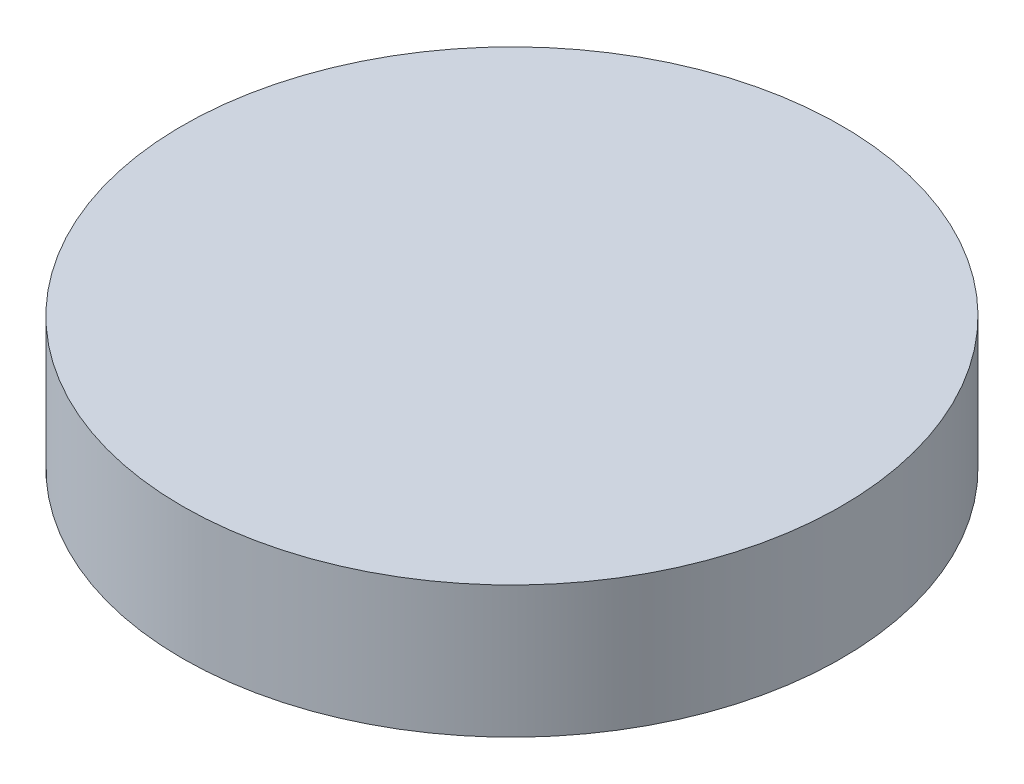
ISO-10303-21;
HEADER;
FILE_DESCRIPTION(('STEP AP214'),'2;1');
FILE_NAME('part.step','',(''),(''),'','','');
FILE_SCHEMA(('AUTOMOTIVE_DESIGN { 1 0 10303 214 1 1 1 1 }'));
ENDSEC;
DATA;
#1=APPLICATION_CONTEXT('core data for automotive mechanical design processes');
#2=APPLICATION_PROTOCOL_DEFINITION('international standard','automotive_design',2000,#1);
#3=PRODUCT_CONTEXT('',#1,'mechanical');
#4=PRODUCT('Part','Part','',(#3));
#5=PRODUCT_RELATED_PRODUCT_CATEGORY('part','',(#4));
#6=PRODUCT_DEFINITION_FORMATION('','',#4);
#7=PRODUCT_DEFINITION_CONTEXT('part definition',#1,'design');
#8=PRODUCT_DEFINITION('design','',#6,#7);
#9=PRODUCT_DEFINITION_SHAPE('','',#8);
#10=(LENGTH_UNIT() NAMED_UNIT(*) SI_UNIT(.MILLI.,.METRE.));
#11=(NAMED_UNIT(*) PLANE_ANGLE_UNIT() SI_UNIT($,.RADIAN.));
#12=(NAMED_UNIT(*) SI_UNIT($,.STERADIAN.) SOLID_ANGLE_UNIT());
#13=UNCERTAINTY_MEASURE_WITH_UNIT(LENGTH_MEASURE(1.E-05),#10,'distance_accuracy_value','');
#14=(GEOMETRIC_REPRESENTATION_CONTEXT(3) GLOBAL_UNCERTAINTY_ASSIGNED_CONTEXT((#13)) GLOBAL_UNIT_ASSIGNED_CONTEXT((#10,
#11,#12)) REPRESENTATION_CONTEXT('',''));
#15=CARTESIAN_POINT('',(0.,0.,0.));
#16=DIRECTION('',(0.,0.,1.));
#17=DIRECTION('',(1.,0.,0.));
#18=AXIS2_PLACEMENT_3D('',#15,#16,#17);
#19=CARTESIAN_POINT('',(0.,2.54,0.));
#20=DIRECTION('',(0.,-1.,0.));
#21=DIRECTION('',(0.,0.,-1.));
#22=AXIS2_PLACEMENT_3D('',#19,#20,#21);
#23=CYLINDRICAL_SURFACE('',#22,6.35);
#24=CARTESIAN_POINT('',(0.,2.54,0.));
#25=DIRECTION('',(0.,1.,0.));
#26=DIRECTION('',(0.,0.,1.));
#27=AXIS2_PLACEMENT_3D('',#24,#25,#26);
#28=CIRCLE('',#27,6.35);
#29=CARTESIAN_POINT('',(0.,2.54,6.35));
#30=VERTEX_POINT('',#29);
#31=EDGE_CURVE('E10',#30,#30,#28,.T.);
#32=ORIENTED_EDGE('',*,*,#31,.F.);
#33=EDGE_LOOP('',(#32));
#34=FACE_BOUND('',#33,.T.);
#35=CARTESIAN_POINT('',(0.,0.,0.));
#36=DIRECTION('',(0.,1.,0.));
#37=DIRECTION('',(0.,0.,1.));
#38=AXIS2_PLACEMENT_3D('',#35,#36,#37);
#39=CIRCLE('',#38,6.35);
#40=CARTESIAN_POINT('',(0.,0.,6.35));
#41=VERTEX_POINT('',#40);
#42=EDGE_CURVE('E36',#41,#41,#39,.T.);
#43=ORIENTED_EDGE('',*,*,#42,.T.);
#44=EDGE_LOOP('',(#43));
#45=FACE_BOUND('',#44,.T.);
#46=ADVANCED_FACE('F33',(#34,#45),#23,.T.);
#47=CARTESIAN_POINT('',(0.,2.54,0.));
#48=DIRECTION('',(0.,1.,0.));
#49=DIRECTION('',(0.,0.,1.));
#50=AXIS2_PLACEMENT_3D('',#47,#48,#49);
#51=PLANE('',#50);
#52=ORIENTED_EDGE('',*,*,#31,.T.);
#53=EDGE_LOOP('',(#52));
#54=FACE_BOUND('',#53,.T.);
#55=ADVANCED_FACE('F48',(#54),#51,.T.);
#56=CARTESIAN_POINT('',(0.,0.,0.));
#57=DIRECTION('',(0.,1.,0.));
#58=DIRECTION('',(0.,0.,1.));
#59=AXIS2_PLACEMENT_3D('',#56,#57,#58);
#60=PLANE('',#59);
#61=ORIENTED_EDGE('',*,*,#42,.F.);
#62=EDGE_LOOP('',(#61));
#63=FACE_BOUND('',#62,.T.);
#64=ADVANCED_FACE('F46',(#63),#60,.F.);
#65=CLOSED_SHELL('',(#46,#55,#64));
#66=MANIFOLD_SOLID_BREP('B2',#65);
#67=ADVANCED_BREP_SHAPE_REPRESENTATION('',(#18,#66),#14);
#68=SHAPE_DEFINITION_REPRESENTATION(#9,#67);
ENDSEC;
END-ISO-10303-21;
